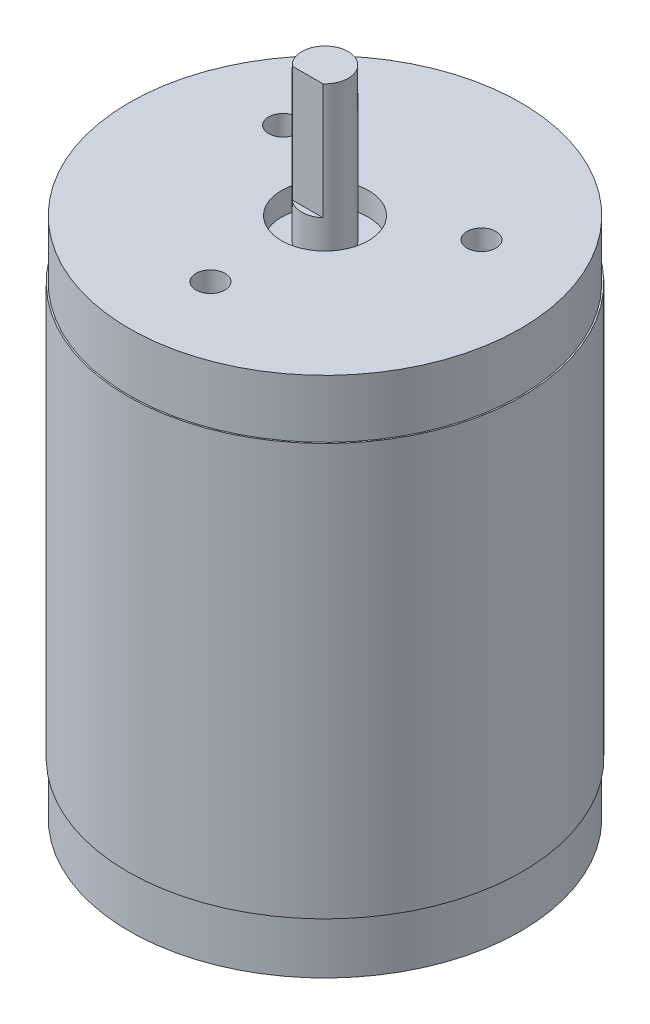
ISO-10303-21;
HEADER;
FILE_DESCRIPTION(('STEP AP214'),'2;1');
FILE_NAME('part.step','',(''),(''),'','','');
FILE_SCHEMA(('AUTOMOTIVE_DESIGN { 1 0 10303 214 1 1 1 1 }'));
ENDSEC;
DATA;
#1=APPLICATION_CONTEXT('core data for automotive mechanical design processes');
#2=APPLICATION_PROTOCOL_DEFINITION('international standard','automotive_design',2000,#1);
#3=PRODUCT_CONTEXT('',#1,'mechanical');
#4=PRODUCT('Part','Part','',(#3));
#5=PRODUCT_RELATED_PRODUCT_CATEGORY('part','',(#4));
#6=PRODUCT_DEFINITION_FORMATION('','',#4);
#7=PRODUCT_DEFINITION_CONTEXT('part definition',#1,'design');
#8=PRODUCT_DEFINITION('design','',#6,#7);
#9=PRODUCT_DEFINITION_SHAPE('','',#8);
#10=(LENGTH_UNIT() NAMED_UNIT(*) SI_UNIT(.MILLI.,.METRE.));
#11=(NAMED_UNIT(*) PLANE_ANGLE_UNIT() SI_UNIT($,.RADIAN.));
#12=(NAMED_UNIT(*) SI_UNIT($,.STERADIAN.) SOLID_ANGLE_UNIT());
#13=UNCERTAINTY_MEASURE_WITH_UNIT(LENGTH_MEASURE(1.E-05),#10,'distance_accuracy_value','');
#14=(GEOMETRIC_REPRESENTATION_CONTEXT(3) GLOBAL_UNCERTAINTY_ASSIGNED_CONTEXT((#13)) GLOBAL_UNIT_ASSIGNED_CONTEXT((#10,
#11,#12)) REPRESENTATION_CONTEXT('',''));
#15=CARTESIAN_POINT('',(0.,0.,0.));
#16=DIRECTION('',(0.,0.,1.));
#17=DIRECTION('',(1.,0.,0.));
#18=AXIS2_PLACEMENT_3D('',#15,#16,#17);
#19=CARTESIAN_POINT('',(33.75,0.,0.));
#20=DIRECTION('',(0.,1.,0.));
#21=DIRECTION('',(-1.,0.,0.));
#22=AXIS2_PLACEMENT_3D('',#19,#20,#21);
#23=PLANE('',#22);
#24=CARTESIAN_POINT('',(0.,0.,0.));
#25=DIRECTION('',(0.,-1.,0.));
#26=DIRECTION('',(1.,0.,0.));
#27=AXIS2_PLACEMENT_3D('',#24,#25,#26);
#28=CIRCLE('',#27,32.75);
#29=CARTESIAN_POINT('',(32.75,0.,0.));
#30=VERTEX_POINT('',#29);
#31=EDGE_CURVE('P0_E49',#30,#30,#28,.T.);
#32=ORIENTED_EDGE('',*,*,#31,.T.);
#33=EDGE_LOOP('',(#32));
#34=FACE_BOUND('',#33,.T.);
#35=CARTESIAN_POINT('',(0.,0.,0.));
#36=DIRECTION('',(0.,-1.,0.));
#37=DIRECTION('',(1.,0.,0.));
#38=AXIS2_PLACEMENT_3D('',#35,#36,#37);
#39=CIRCLE('',#38,33.75);
#40=CARTESIAN_POINT('',(33.75,0.,0.));
#41=VERTEX_POINT('',#40);
#42=EDGE_CURVE('P0_E10',#41,#41,#39,.T.);
#43=ORIENTED_EDGE('',*,*,#42,.F.);
#44=EDGE_LOOP('',(#43));
#45=FACE_BOUND('',#44,.T.);
#46=ADVANCED_FACE('P0_F15',(#34,#45),#23,.T.);
#47=CARTESIAN_POINT('',(0.,-19.,0.));
#48=DIRECTION('',(0.,-1.,0.));
#49=DIRECTION('',(1.,0.,0.));
#50=AXIS2_PLACEMENT_3D('',#47,#48,#49);
#51=CYLINDRICAL_SURFACE('',#50,33.75);
#52=ORIENTED_EDGE('',*,*,#42,.T.);
#53=EDGE_LOOP('',(#52));
#54=FACE_BOUND('',#53,.T.);
#55=CARTESIAN_POINT('',(0.,-9.,0.));
#56=DIRECTION('',(0.,-1.,0.));
#57=DIRECTION('',(1.,0.,0.));
#58=AXIS2_PLACEMENT_3D('',#55,#56,#57);
#59=CIRCLE('',#58,33.75);
#60=CARTESIAN_POINT('',(33.75,-9.,0.));
#61=VERTEX_POINT('',#60);
#62=EDGE_CURVE('P0_E21',#61,#61,#59,.T.);
#63=ORIENTED_EDGE('',*,*,#62,.F.);
#64=EDGE_LOOP('',(#63));
#65=FACE_BOUND('',#64,.T.);
#66=ADVANCED_FACE('P0_F68',(#54,#65),#51,.T.);
#67=CARTESIAN_POINT('',(33.75,-9.,0.));
#68=DIRECTION('',(0.,-1.,0.));
#69=DIRECTION('',(1.,0.,0.));
#70=AXIS2_PLACEMENT_3D('',#67,#68,#69);
#71=PLANE('',#70);
#72=ORIENTED_EDGE('',*,*,#62,.T.);
#73=EDGE_LOOP('',(#72));
#74=FACE_BOUND('',#73,.T.);
#75=CARTESIAN_POINT('',(0.,-9.,0.));
#76=DIRECTION('',(0.,-1.,0.));
#77=DIRECTION('',(1.,0.,0.));
#78=AXIS2_PLACEMENT_3D('',#75,#76,#77);
#79=CIRCLE('',#78,13.25);
#80=CARTESIAN_POINT('',(13.25,-9.,0.));
#81=VERTEX_POINT('',#80);
#82=EDGE_CURVE('P0_E25',#81,#81,#79,.T.);
#83=ORIENTED_EDGE('',*,*,#82,.F.);
#84=EDGE_LOOP('',(#83));
#85=FACE_BOUND('',#84,.T.);
#86=ADVANCED_FACE('P0_F72',(#74,#85),#71,.T.);
#87=CARTESIAN_POINT('',(0.,-19.,0.));
#88=DIRECTION('',(0.,-1.,0.));
#89=DIRECTION('',(1.,0.,0.));
#90=AXIS2_PLACEMENT_3D('',#87,#88,#89);
#91=CYLINDRICAL_SURFACE('',#90,13.25);
#92=ORIENTED_EDGE('',*,*,#82,.T.);
#93=EDGE_LOOP('',(#92));
#94=FACE_BOUND('',#93,.T.);
#95=CARTESIAN_POINT('',(0.,-19.,0.));
#96=DIRECTION('',(0.,-1.,0.));
#97=DIRECTION('',(1.,0.,0.));
#98=AXIS2_PLACEMENT_3D('',#95,#96,#97);
#99=CIRCLE('',#98,13.25);
#100=CARTESIAN_POINT('',(13.25,-19.,0.));
#101=VERTEX_POINT('',#100);
#102=EDGE_CURVE('P0_E29',#101,#101,#99,.T.);
#103=ORIENTED_EDGE('',*,*,#102,.F.);
#104=EDGE_LOOP('',(#103));
#105=FACE_BOUND('',#104,.T.);
#106=ADVANCED_FACE('P0_F76',(#94,#105),#91,.T.);
#107=CARTESIAN_POINT('',(13.25,-19.,0.));
#108=DIRECTION('',(0.,-1.,0.));
#109=DIRECTION('',(1.,0.,0.));
#110=AXIS2_PLACEMENT_3D('',#107,#108,#109);
#111=PLANE('',#110);
#112=ORIENTED_EDGE('',*,*,#102,.T.);
#113=EDGE_LOOP('',(#112));
#114=FACE_BOUND('',#113,.T.);
#115=ADVANCED_FACE('P0_F82',(#114),#111,.T.);
#116=CARTESIAN_POINT('',(11.25,-17.,0.));
#117=DIRECTION('',(0.,1.,0.));
#118=DIRECTION('',(-1.,0.,0.));
#119=AXIS2_PLACEMENT_3D('',#116,#117,#118);
#120=PLANE('',#119);
#121=CARTESIAN_POINT('',(0.,-17.,0.));
#122=DIRECTION('',(0.,-1.,0.));
#123=DIRECTION('',(1.,0.,0.));
#124=AXIS2_PLACEMENT_3D('',#121,#122,#123);
#125=CIRCLE('',#124,11.25);
#126=CARTESIAN_POINT('',(11.25,-17.,0.));
#127=VERTEX_POINT('',#126);
#128=EDGE_CURVE('P0_E34',#127,#127,#125,.T.);
#129=ORIENTED_EDGE('',*,*,#128,.F.);
#130=EDGE_LOOP('',(#129));
#131=FACE_BOUND('',#130,.T.);
#132=ADVANCED_FACE('P0_F86',(#131),#120,.T.);
#133=CARTESIAN_POINT('',(0.,-19.,0.));
#134=DIRECTION('',(0.,-1.,0.));
#135=DIRECTION('',(1.,0.,0.));
#136=AXIS2_PLACEMENT_3D('',#133,#134,#135);
#137=CYLINDRICAL_SURFACE('',#136,11.25);
#138=ORIENTED_EDGE('',*,*,#128,.T.);
#139=EDGE_LOOP('',(#138));
#140=FACE_BOUND('',#139,.T.);
#141=CARTESIAN_POINT('',(0.,-7.,0.));
#142=DIRECTION('',(0.,-1.,0.));
#143=DIRECTION('',(1.,0.,0.));
#144=AXIS2_PLACEMENT_3D('',#141,#142,#143);
#145=CIRCLE('',#144,11.25);
#146=CARTESIAN_POINT('',(11.25,-7.,0.));
#147=VERTEX_POINT('',#146);
#148=EDGE_CURVE('P0_E37',#147,#147,#145,.T.);
#149=ORIENTED_EDGE('',*,*,#148,.F.);
#150=EDGE_LOOP('',(#149));
#151=FACE_BOUND('',#150,.T.);
#152=ADVANCED_FACE('P0_F90',(#140,#151),#137,.F.);
#153=CARTESIAN_POINT('',(31.75,-7.,0.));
#154=DIRECTION('',(0.,1.,0.));
#155=DIRECTION('',(-1.,0.,0.));
#156=AXIS2_PLACEMENT_3D('',#153,#154,#155);
#157=PLANE('',#156);
#158=ORIENTED_EDGE('',*,*,#148,.T.);
#159=EDGE_LOOP('',(#158));
#160=FACE_BOUND('',#159,.T.);
#161=CARTESIAN_POINT('',(0.,-7.,0.));
#162=DIRECTION('',(0.,-1.,0.));
#163=DIRECTION('',(1.,0.,0.));
#164=AXIS2_PLACEMENT_3D('',#161,#162,#163);
#165=CIRCLE('',#164,31.75);
#166=CARTESIAN_POINT('',(31.75,-7.,0.));
#167=VERTEX_POINT('',#166);
#168=EDGE_CURVE('P0_E40',#167,#167,#165,.T.);
#169=ORIENTED_EDGE('',*,*,#168,.F.);
#170=EDGE_LOOP('',(#169));
#171=FACE_BOUND('',#170,.T.);
#172=ADVANCED_FACE('P0_F94',(#160,#171),#157,.T.);
#173=CARTESIAN_POINT('',(0.,-19.,0.));
#174=DIRECTION('',(0.,-1.,0.));
#175=DIRECTION('',(1.,0.,0.));
#176=AXIS2_PLACEMENT_3D('',#173,#174,#175);
#177=CYLINDRICAL_SURFACE('',#176,31.75);
#178=ORIENTED_EDGE('',*,*,#168,.T.);
#179=EDGE_LOOP('',(#178));
#180=FACE_BOUND('',#179,.T.);
#181=CARTESIAN_POINT('',(0.,3.,0.));
#182=DIRECTION('',(0.,-1.,0.));
#183=DIRECTION('',(1.,0.,0.));
#184=AXIS2_PLACEMENT_3D('',#181,#182,#183);
#185=CIRCLE('',#184,31.75);
#186=CARTESIAN_POINT('',(31.75,3.,0.));
#187=VERTEX_POINT('',#186);
#188=EDGE_CURVE('P0_E43',#187,#187,#185,.T.);
#189=ORIENTED_EDGE('',*,*,#188,.F.);
#190=EDGE_LOOP('',(#189));
#191=FACE_BOUND('',#190,.T.);
#192=ADVANCED_FACE('P0_F64',(#180,#191),#177,.F.);
#193=CARTESIAN_POINT('',(32.75,3.,0.));
#194=DIRECTION('',(0.,1.,0.));
#195=DIRECTION('',(-1.,0.,0.));
#196=AXIS2_PLACEMENT_3D('',#193,#194,#195);
#197=PLANE('',#196);
#198=ORIENTED_EDGE('',*,*,#188,.T.);
#199=EDGE_LOOP('',(#198));
#200=FACE_BOUND('',#199,.T.);
#201=CARTESIAN_POINT('',(0.,3.,0.));
#202=DIRECTION('',(0.,-1.,0.));
#203=DIRECTION('',(1.,0.,0.));
#204=AXIS2_PLACEMENT_3D('',#201,#202,#203);
#205=CIRCLE('',#204,32.75);
#206=CARTESIAN_POINT('',(32.75,3.,0.));
#207=VERTEX_POINT('',#206);
#208=EDGE_CURVE('P0_E46',#207,#207,#205,.T.);
#209=ORIENTED_EDGE('',*,*,#208,.F.);
#210=EDGE_LOOP('',(#209));
#211=FACE_BOUND('',#210,.T.);
#212=ADVANCED_FACE('P0_F57',(#200,#211),#197,.T.);
#213=CARTESIAN_POINT('',(0.,-19.,0.));
#214=DIRECTION('',(0.,-1.,0.));
#215=DIRECTION('',(1.,0.,0.));
#216=AXIS2_PLACEMENT_3D('',#213,#214,#215);
#217=CYLINDRICAL_SURFACE('',#216,32.75);
#218=ORIENTED_EDGE('',*,*,#208,.T.);
#219=EDGE_LOOP('',(#218));
#220=FACE_BOUND('',#219,.T.);
#221=ORIENTED_EDGE('',*,*,#31,.F.);
#222=EDGE_LOOP('',(#221));
#223=FACE_BOUND('',#222,.T.);
#224=ADVANCED_FACE('P0_F55',(#220,#223),#217,.T.);
#225=CLOSED_SHELL('',(#46,#66,#86,#106,#115,#132,#152,#172,#192,#212,#224));
#226=MANIFOLD_SOLID_BREP('P0_B1',#225);
#227=CARTESIAN_POINT('',(0.,71.,0.));
#228=DIRECTION('',(0.,1.,0.));
#229=DIRECTION('',(0.,0.,1.));
#230=AXIS2_PLACEMENT_3D('',#227,#228,#229);
#231=PLANE('',#230);
#232=CARTESIAN_POINT('',(0.,71.,0.));
#233=DIRECTION('',(0.,1.,0.));
#234=DIRECTION('',(0.,0.,1.));
#235=AXIS2_PLACEMENT_3D('',#232,#233,#234);
#236=CIRCLE('',#235,34.);
#237=CARTESIAN_POINT('',(0.,71.,34.));
#238=VERTEX_POINT('',#237);
#239=EDGE_CURVE('P1_E10',#238,#238,#236,.T.);
#240=ORIENTED_EDGE('',*,*,#239,.T.);
#241=EDGE_LOOP('',(#240));
#242=FACE_BOUND('',#241,.T.);
#243=CARTESIAN_POINT('',(0.,71.,0.));
#244=DIRECTION('',(0.,1.,0.));
#245=DIRECTION('',(0.,0.,1.));
#246=AXIS2_PLACEMENT_3D('',#243,#244,#245);
#247=CIRCLE('',#246,33.);
#248=CARTESIAN_POINT('',(0.,71.,33.));
#249=VERTEX_POINT('',#248);
#250=EDGE_CURVE('P1_E26',#249,#249,#247,.T.);
#251=ORIENTED_EDGE('',*,*,#250,.F.);
#252=EDGE_LOOP('',(#251));
#253=FACE_BOUND('',#252,.T.);
#254=ADVANCED_FACE('P1_F15',(#242,#253),#231,.T.);
#255=CARTESIAN_POINT('',(0.,0.,0.));
#256=DIRECTION('',(0.,1.,0.));
#257=DIRECTION('',(0.,0.,1.));
#258=AXIS2_PLACEMENT_3D('',#255,#256,#257);
#259=PLANE('',#258);
#260=CARTESIAN_POINT('',(0.,0.,0.));
#261=DIRECTION('',(0.,1.,0.));
#262=DIRECTION('',(0.,0.,1.));
#263=AXIS2_PLACEMENT_3D('',#260,#261,#262);
#264=CIRCLE('',#263,34.);
#265=CARTESIAN_POINT('',(0.,0.,34.));
#266=VERTEX_POINT('',#265);
#267=EDGE_CURVE('P1_E19',#266,#266,#264,.T.);
#268=ORIENTED_EDGE('',*,*,#267,.F.);
#269=EDGE_LOOP('',(#268));
#270=FACE_BOUND('',#269,.T.);
#271=CARTESIAN_POINT('',(0.,0.,0.));
#272=DIRECTION('',(0.,1.,0.));
#273=DIRECTION('',(0.,0.,1.));
#274=AXIS2_PLACEMENT_3D('',#271,#272,#273);
#275=CIRCLE('',#274,33.);
#276=CARTESIAN_POINT('',(0.,0.,33.));
#277=VERTEX_POINT('',#276);
#278=EDGE_CURVE('P1_E28',#277,#277,#275,.T.);
#279=ORIENTED_EDGE('',*,*,#278,.T.);
#280=EDGE_LOOP('',(#279));
#281=FACE_BOUND('',#280,.T.);
#282=ADVANCED_FACE('P1_F38',(#270,#281),#259,.F.);
#283=CARTESIAN_POINT('',(0.,71.,0.));
#284=DIRECTION('',(0.,-1.,0.));
#285=DIRECTION('',(0.,0.,-1.));
#286=AXIS2_PLACEMENT_3D('',#283,#284,#285);
#287=CYLINDRICAL_SURFACE('',#286,34.);
#288=ORIENTED_EDGE('',*,*,#239,.F.);
#289=EDGE_LOOP('',(#288));
#290=FACE_BOUND('',#289,.T.);
#291=ORIENTED_EDGE('',*,*,#267,.T.);
#292=EDGE_LOOP('',(#291));
#293=FACE_BOUND('',#292,.T.);
#294=ADVANCED_FACE('P1_F17',(#290,#293),#287,.T.);
#295=CARTESIAN_POINT('',(0.,71.,0.));
#296=DIRECTION('',(0.,-1.,0.));
#297=DIRECTION('',(0.,0.,-1.));
#298=AXIS2_PLACEMENT_3D('',#295,#296,#297);
#299=CYLINDRICAL_SURFACE('',#298,33.);
#300=ORIENTED_EDGE('',*,*,#250,.T.);
#301=EDGE_LOOP('',(#300));
#302=FACE_BOUND('',#301,.T.);
#303=ORIENTED_EDGE('',*,*,#278,.F.);
#304=EDGE_LOOP('',(#303));
#305=FACE_BOUND('',#304,.T.);
#306=ADVANCED_FACE('P1_F34',(#302,#305),#299,.F.);
#307=CLOSED_SHELL('',(#254,#282,#294,#306));
#308=MANIFOLD_SOLID_BREP('P1_B1',#307);
#309=CARTESIAN_POINT('',(0.,103.5,0.));
#310=DIRECTION('',(0.,1.,0.));
#311=DIRECTION('',(0.,0.,1.));
#312=AXIS2_PLACEMENT_3D('',#309,#310,#311);
#313=PLANE('',#312);
#314=DIRECTION('',(-1.,0.,0.));
#315=VECTOR('',#314,1.);
#316=CARTESIAN_POINT('',(-2.64575131106459,103.5,3.));
#317=LINE('',#316,#315);
#318=CARTESIAN_POINT('',(2.64575131106459,103.5,3.));
#319=VERTEX_POINT('',#318);
#320=CARTESIAN_POINT('',(-2.64575131106459,103.5,3.));
#321=VERTEX_POINT('',#320);
#322=EDGE_CURVE('P2_E44',#319,#321,#317,.T.);
#323=ORIENTED_EDGE('',*,*,#322,.F.);
#324=CARTESIAN_POINT('',(0.,103.5,0.));
#325=DIRECTION('',(0.,-1.,0.));
#326=DIRECTION('',(0.,0.,-1.));
#327=AXIS2_PLACEMENT_3D('',#324,#325,#326);
#328=CIRCLE('',#327,4.);
#329=EDGE_CURVE('P2_E10',#321,#319,#328,.T.);
#330=ORIENTED_EDGE('',*,*,#329,.F.);
#331=EDGE_LOOP('',(#323,#330));
#332=FACE_BOUND('',#331,.T.);
#333=ADVANCED_FACE('P2_F16',(#332),#313,.T.);
#334=CARTESIAN_POINT('',(0.,75.,0.));
#335=DIRECTION('',(0.,-1.,0.));
#336=DIRECTION('',(0.,0.,-1.));
#337=AXIS2_PLACEMENT_3D('',#334,#335,#336);
#338=CYLINDRICAL_SURFACE('',#337,4.);
#339=DIRECTION('',(0.,1.,0.));
#340=VECTOR('',#339,1.);
#341=CARTESIAN_POINT('',(2.64575131106459,83.5,3.));
#342=LINE('',#341,#340);
#343=CARTESIAN_POINT('',(2.64575131106459,83.5,3.));
#344=VERTEX_POINT('',#343);
#345=EDGE_CURVE('P2_E41',#344,#319,#342,.T.);
#346=ORIENTED_EDGE('',*,*,#345,.F.);
#347=CARTESIAN_POINT('',(0.,83.5,0.));
#348=DIRECTION('',(0.,1.,0.));
#349=DIRECTION('',(0.,0.,1.));
#350=AXIS2_PLACEMENT_3D('',#347,#348,#349);
#351=CIRCLE('',#350,4.);
#352=CARTESIAN_POINT('',(-2.64575131106459,83.5,3.));
#353=VERTEX_POINT('',#352);
#354=EDGE_CURVE('P2_E34',#353,#344,#351,.T.);
#355=ORIENTED_EDGE('',*,*,#354,.F.);
#356=DIRECTION('',(0.,1.,0.));
#357=VECTOR('',#356,1.);
#358=CARTESIAN_POINT('',(-2.64575131106459,83.5,3.));
#359=LINE('',#358,#357);
#360=EDGE_CURVE('P2_E47',#353,#321,#359,.T.);
#361=ORIENTED_EDGE('',*,*,#360,.T.);
#362=ORIENTED_EDGE('',*,*,#329,.T.);
#363=EDGE_LOOP('',(#346,#355,#361,#362));
#364=FACE_BOUND('',#363,.T.);
#365=CARTESIAN_POINT('',(0.,77.,0.));
#366=DIRECTION('',(0.,-1.,0.));
#367=DIRECTION('',(0.,0.,-1.));
#368=AXIS2_PLACEMENT_3D('',#365,#366,#367);
#369=CIRCLE('',#368,4.);
#370=CARTESIAN_POINT('',(0.,77.,-4.));
#371=VERTEX_POINT('',#370);
#372=EDGE_CURVE('P2_E23',#371,#371,#369,.T.);
#373=ORIENTED_EDGE('',*,*,#372,.F.);
#374=EDGE_LOOP('',(#373));
#375=FACE_BOUND('',#374,.T.);
#376=ADVANCED_FACE('P2_F52',(#364,#375),#338,.T.);
#377=CARTESIAN_POINT('',(4.,77.,0.));
#378=DIRECTION('',(0.,1.,0.));
#379=DIRECTION('',(0.,0.,1.));
#380=AXIS2_PLACEMENT_3D('',#377,#378,#379);
#381=PLANE('',#380);
#382=ORIENTED_EDGE('',*,*,#372,.T.);
#383=EDGE_LOOP('',(#382));
#384=FACE_BOUND('',#383,.T.);
#385=CARTESIAN_POINT('',(0.,77.,0.));
#386=DIRECTION('',(0.,-1.,0.));
#387=DIRECTION('',(0.,0.,-1.));
#388=AXIS2_PLACEMENT_3D('',#385,#386,#387);
#389=CIRCLE('',#388,10.);
#390=CARTESIAN_POINT('',(0.,77.,-10.));
#391=VERTEX_POINT('',#390);
#392=EDGE_CURVE('P2_E57',#391,#391,#389,.T.);
#393=ORIENTED_EDGE('',*,*,#392,.F.);
#394=EDGE_LOOP('',(#393));
#395=FACE_BOUND('',#394,.T.);
#396=ADVANCED_FACE('P2_F65',(#384,#395),#381,.T.);
#397=CARTESIAN_POINT('',(0.,75.,0.));
#398=DIRECTION('',(0.,-1.,0.));
#399=DIRECTION('',(0.,0.,-1.));
#400=AXIS2_PLACEMENT_3D('',#397,#398,#399);
#401=CYLINDRICAL_SURFACE('',#400,10.);
#402=ORIENTED_EDGE('',*,*,#392,.T.);
#403=EDGE_LOOP('',(#402));
#404=FACE_BOUND('',#403,.T.);
#405=CARTESIAN_POINT('',(0.,75.,0.));
#406=DIRECTION('',(0.,-1.,0.));
#407=DIRECTION('',(0.,0.,-1.));
#408=AXIS2_PLACEMENT_3D('',#405,#406,#407);
#409=CIRCLE('',#408,10.);
#410=CARTESIAN_POINT('',(0.,75.,-10.));
#411=VERTEX_POINT('',#410);
#412=EDGE_CURVE('P2_E54',#411,#411,#409,.T.);
#413=ORIENTED_EDGE('',*,*,#412,.F.);
#414=EDGE_LOOP('',(#413));
#415=FACE_BOUND('',#414,.T.);
#416=ADVANCED_FACE('P2_F73',(#404,#415),#401,.T.);
#417=CARTESIAN_POINT('',(10.,75.,0.));
#418=DIRECTION('',(0.,-1.,0.));
#419=DIRECTION('',(0.,0.,-1.));
#420=AXIS2_PLACEMENT_3D('',#417,#418,#419);
#421=PLANE('',#420);
#422=ORIENTED_EDGE('',*,*,#412,.T.);
#423=EDGE_LOOP('',(#422));
#424=FACE_BOUND('',#423,.T.);
#425=ADVANCED_FACE('P2_F78',(#424),#421,.T.);
#426=CARTESIAN_POINT('',(-2.64575131106459,83.5,3.));
#427=DIRECTION('',(0.,0.,-1.));
#428=DIRECTION('',(-1.,0.,0.));
#429=AXIS2_PLACEMENT_3D('',#426,#427,#428);
#430=PLANE('',#429);
#431=ORIENTED_EDGE('',*,*,#322,.T.);
#432=ORIENTED_EDGE('',*,*,#360,.F.);
#433=DIRECTION('',(-1.,0.,0.));
#434=VECTOR('',#433,1.);
#435=CARTESIAN_POINT('',(-2.64575131106459,83.5,3.));
#436=LINE('',#435,#434);
#437=EDGE_CURVE('P2_E29',#344,#353,#436,.T.);
#438=ORIENTED_EDGE('',*,*,#437,.F.);
#439=ORIENTED_EDGE('',*,*,#345,.T.);
#440=EDGE_LOOP('',(#431,#432,#438,#439));
#441=FACE_BOUND('',#440,.T.);
#442=ADVANCED_FACE('P2_F43',(#441),#430,.F.);
#443=CARTESIAN_POINT('',(0.,83.5,0.));
#444=DIRECTION('',(0.,1.,0.));
#445=DIRECTION('',(0.,0.,1.));
#446=AXIS2_PLACEMENT_3D('',#443,#444,#445);
#447=PLANE('',#446);
#448=ORIENTED_EDGE('',*,*,#354,.T.);
#449=ORIENTED_EDGE('',*,*,#437,.T.);
#450=EDGE_LOOP('',(#448,#449));
#451=FACE_BOUND('',#450,.T.);
#452=ADVANCED_FACE('P2_F85',(#451),#447,.T.);
#453=CLOSED_SHELL('',(#333,#376,#396,#416,#425,#442,#452));
#454=MANIFOLD_SOLID_BREP('P2_B1',#453);
#455=CARTESIAN_POINT('',(0.,81.,0.));
#456=DIRECTION('',(0.,1.,0.));
#457=DIRECTION('',(-1.,0.,0.));
#458=AXIS2_PLACEMENT_3D('',#455,#456,#457);
#459=CYLINDRICAL_SURFACE('',#458,31.75);
#460=CARTESIAN_POINT('',(0.,68.,0.));
#461=DIRECTION('',(0.,1.,0.));
#462=DIRECTION('',(-1.,0.,0.));
#463=AXIS2_PLACEMENT_3D('',#460,#461,#462);
#464=CIRCLE('',#463,31.75);
#465=CARTESIAN_POINT('',(-31.75,68.,0.));
#466=VERTEX_POINT('',#465);
#467=EDGE_CURVE('P3_E10',#466,#466,#464,.T.);
#468=ORIENTED_EDGE('',*,*,#467,.F.);
#469=EDGE_LOOP('',(#468));
#470=FACE_BOUND('',#469,.T.);
#471=CARTESIAN_POINT('',(0.,77.,0.));
#472=DIRECTION('',(0.,1.,0.));
#473=DIRECTION('',(-1.,0.,0.));
#474=AXIS2_PLACEMENT_3D('',#471,#472,#473);
#475=CIRCLE('',#474,31.75);
#476=CARTESIAN_POINT('',(-31.75,77.,0.));
#477=VERTEX_POINT('',#476);
#478=EDGE_CURVE('P3_E42',#477,#477,#475,.T.);
#479=ORIENTED_EDGE('',*,*,#478,.T.);
#480=EDGE_LOOP('',(#479));
#481=FACE_BOUND('',#480,.T.);
#482=ADVANCED_FACE('P3_F15',(#470,#481),#459,.F.);
#483=CARTESIAN_POINT('',(31.75,68.,0.));
#484=DIRECTION('',(0.,1.,0.));
#485=DIRECTION('',(-1.,0.,0.));
#486=AXIS2_PLACEMENT_3D('',#483,#484,#485);
#487=PLANE('',#486);
#488=CARTESIAN_POINT('',(0.,68.,0.));
#489=DIRECTION('',(0.,1.,0.));
#490=DIRECTION('',(-1.,0.,0.));
#491=AXIS2_PLACEMENT_3D('',#488,#489,#490);
#492=CIRCLE('',#491,32.75);
#493=CARTESIAN_POINT('',(-32.75,68.,0.));
#494=VERTEX_POINT('',#493);
#495=EDGE_CURVE('P3_E22',#494,#494,#492,.T.);
#496=ORIENTED_EDGE('',*,*,#495,.F.);
#497=EDGE_LOOP('',(#496));
#498=FACE_BOUND('',#497,.T.);
#499=ORIENTED_EDGE('',*,*,#467,.T.);
#500=EDGE_LOOP('',(#499));
#501=FACE_BOUND('',#500,.T.);
#502=ADVANCED_FACE('P3_F66',(#498,#501),#487,.F.);
#503=CARTESIAN_POINT('',(0.,81.,0.));
#504=DIRECTION('',(0.,1.,0.));
#505=DIRECTION('',(-1.,0.,0.));
#506=AXIS2_PLACEMENT_3D('',#503,#504,#505);
#507=CYLINDRICAL_SURFACE('',#506,32.75);
#508=CARTESIAN_POINT('',(0.,71.,0.));
#509=DIRECTION('',(0.,1.,0.));
#510=DIRECTION('',(-1.,0.,0.));
#511=AXIS2_PLACEMENT_3D('',#508,#509,#510);
#512=CIRCLE('',#511,32.75);
#513=CARTESIAN_POINT('',(-32.75,71.,0.));
#514=VERTEX_POINT('',#513);
#515=EDGE_CURVE('P3_E27',#514,#514,#512,.T.);
#516=ORIENTED_EDGE('',*,*,#515,.F.);
#517=EDGE_LOOP('',(#516));
#518=FACE_BOUND('',#517,.T.);
#519=ORIENTED_EDGE('',*,*,#495,.T.);
#520=EDGE_LOOP('',(#519));
#521=FACE_BOUND('',#520,.T.);
#522=ADVANCED_FACE('P3_F63',(#518,#521),#507,.T.);
#523=CARTESIAN_POINT('',(32.75,71.,0.));
#524=DIRECTION('',(0.,1.,0.));
#525=DIRECTION('',(-1.,0.,0.));
#526=AXIS2_PLACEMENT_3D('',#523,#524,#525);
#527=PLANE('',#526);
#528=CARTESIAN_POINT('',(0.,71.,0.));
#529=DIRECTION('',(0.,1.,0.));
#530=DIRECTION('',(-1.,0.,0.));
#531=AXIS2_PLACEMENT_3D('',#528,#529,#530);
#532=CIRCLE('',#531,33.75);
#533=CARTESIAN_POINT('',(-33.75,71.,0.));
#534=VERTEX_POINT('',#533);
#535=EDGE_CURVE('P3_E51',#534,#534,#532,.T.);
#536=ORIENTED_EDGE('',*,*,#535,.F.);
#537=EDGE_LOOP('',(#536));
#538=FACE_BOUND('',#537,.T.);
#539=ORIENTED_EDGE('',*,*,#515,.T.);
#540=EDGE_LOOP('',(#539));
#541=FACE_BOUND('',#540,.T.);
#542=ADVANCED_FACE('P3_F61',(#538,#541),#527,.F.);
#543=CARTESIAN_POINT('',(0.,81.,0.));
#544=DIRECTION('',(0.,1.,0.));
#545=DIRECTION('',(-1.,0.,0.));
#546=AXIS2_PLACEMENT_3D('',#543,#544,#545);
#547=CYLINDRICAL_SURFACE('',#546,33.75);
#548=CARTESIAN_POINT('',(0.,81.,0.));
#549=DIRECTION('',(0.,1.,0.));
#550=DIRECTION('',(-1.,0.,0.));
#551=AXIS2_PLACEMENT_3D('',#548,#549,#550);
#552=CIRCLE('',#551,33.75);
#553=CARTESIAN_POINT('',(-33.75,81.,0.));
#554=VERTEX_POINT('',#553);
#555=EDGE_CURVE('P3_E46',#554,#554,#552,.T.);
#556=ORIENTED_EDGE('',*,*,#555,.F.);
#557=EDGE_LOOP('',(#556));
#558=FACE_BOUND('',#557,.T.);
#559=ORIENTED_EDGE('',*,*,#535,.T.);
#560=EDGE_LOOP('',(#559));
#561=FACE_BOUND('',#560,.T.);
#562=ADVANCED_FACE('P3_F79',(#558,#561),#547,.T.);
#563=CARTESIAN_POINT('',(33.75,81.,0.));
#564=DIRECTION('',(0.,-1.,0.));
#565=DIRECTION('',(1.,0.,0.));
#566=AXIS2_PLACEMENT_3D('',#563,#564,#565);
#567=PLANE('',#566);
#568=CARTESIAN_POINT('',(0.,81.,19.75));
#569=DIRECTION('',(0.,1.,0.));
#570=DIRECTION('',(-1.,0.,0.));
#571=AXIS2_PLACEMENT_3D('',#568,#569,#570);
#572=CIRCLE('',#571,2.5);
#573=CARTESIAN_POINT('',(-2.5,81.,19.75));
#574=VERTEX_POINT('',#573);
#575=EDGE_CURVE('P3_E35',#574,#574,#572,.T.);
#576=ORIENTED_EDGE('',*,*,#575,.F.);
#577=EDGE_LOOP('',(#576));
#578=FACE_BOUND('',#577,.T.);
#579=CARTESIAN_POINT('',(0.,81.,0.));
#580=DIRECTION('',(0.,1.,0.));
#581=DIRECTION('',(-1.,0.,0.));
#582=AXIS2_PLACEMENT_3D('',#579,#580,#581);
#583=CIRCLE('',#582,7.5);
#584=CARTESIAN_POINT('',(-7.5,81.,0.));
#585=VERTEX_POINT('',#584);
#586=EDGE_CURVE('P3_E115',#585,#585,#583,.T.);
#587=ORIENTED_EDGE('',*,*,#586,.F.);
#588=EDGE_LOOP('',(#587));
#589=FACE_BOUND('',#588,.T.);
#590=CARTESIAN_POINT('',(17.1040017247427,81.,-9.87500000000001));
#591=DIRECTION('',(0.,1.,0.));
#592=DIRECTION('',(-1.,0.,0.));
#593=AXIS2_PLACEMENT_3D('',#590,#591,#592);
#594=CIRCLE('',#593,2.5);
#595=CARTESIAN_POINT('',(14.6040017247427,81.,-9.87500000000001));
#596=VERTEX_POINT('',#595);
#597=EDGE_CURVE('P3_E54',#596,#596,#594,.T.);
#598=ORIENTED_EDGE('',*,*,#597,.F.);
#599=EDGE_LOOP('',(#598));
#600=FACE_BOUND('',#599,.T.);
#601=CARTESIAN_POINT('',(-17.1040017247427,81.,-9.875));
#602=DIRECTION('',(0.,1.,0.));
#603=DIRECTION('',(-1.,0.,0.));
#604=AXIS2_PLACEMENT_3D('',#601,#602,#603);
#605=CIRCLE('',#604,2.5);
#606=CARTESIAN_POINT('',(-19.6040017247427,81.,-9.875));
#607=VERTEX_POINT('',#606);
#608=EDGE_CURVE('P3_E111',#607,#607,#605,.T.);
#609=ORIENTED_EDGE('',*,*,#608,.F.);
#610=EDGE_LOOP('',(#609));
#611=FACE_BOUND('',#610,.T.);
#612=ORIENTED_EDGE('',*,*,#555,.T.);
#613=EDGE_LOOP('',(#612));
#614=FACE_BOUND('',#613,.T.);
#615=ADVANCED_FACE('P3_F83',(#578,#589,#600,#611,#614),#567,.F.);
#616=CARTESIAN_POINT('',(0.,77.,0.));
#617=DIRECTION('',(0.,1.,0.));
#618=DIRECTION('',(-1.,0.,0.));
#619=AXIS2_PLACEMENT_3D('',#616,#617,#618);
#620=PLANE('',#619);
#621=CARTESIAN_POINT('',(0.,77.,19.75));
#622=DIRECTION('',(0.,1.,0.));
#623=DIRECTION('',(-1.,0.,0.));
#624=AXIS2_PLACEMENT_3D('',#621,#622,#623);
#625=CIRCLE('',#624,2.5);
#626=CARTESIAN_POINT('',(-2.5,77.,19.75));
#627=VERTEX_POINT('',#626);
#628=EDGE_CURVE('P3_E18',#627,#627,#625,.T.);
#629=ORIENTED_EDGE('',*,*,#628,.T.);
#630=EDGE_LOOP('',(#629));
#631=FACE_BOUND('',#630,.T.);
#632=CARTESIAN_POINT('',(0.,77.,0.));
#633=DIRECTION('',(0.,1.,0.));
#634=DIRECTION('',(-1.,0.,0.));
#635=AXIS2_PLACEMENT_3D('',#632,#633,#634);
#636=CIRCLE('',#635,7.5);
#637=CARTESIAN_POINT('',(-7.5,77.,0.));
#638=VERTEX_POINT('',#637);
#639=EDGE_CURVE('P3_E37',#638,#638,#636,.T.);
#640=ORIENTED_EDGE('',*,*,#639,.T.);
#641=EDGE_LOOP('',(#640));
#642=FACE_BOUND('',#641,.T.);
#643=CARTESIAN_POINT('',(17.1040017247427,77.,-9.87500000000001));
#644=DIRECTION('',(0.,1.,0.));
#645=DIRECTION('',(-1.,0.,0.));
#646=AXIS2_PLACEMENT_3D('',#643,#644,#645);
#647=CIRCLE('',#646,2.5);
#648=CARTESIAN_POINT('',(14.6040017247427,77.,-9.87500000000001));
#649=VERTEX_POINT('',#648);
#650=EDGE_CURVE('P3_E34',#649,#649,#647,.T.);
#651=ORIENTED_EDGE('',*,*,#650,.T.);
#652=EDGE_LOOP('',(#651));
#653=FACE_BOUND('',#652,.T.);
#654=CARTESIAN_POINT('',(-17.1040017247427,77.,-9.875));
#655=DIRECTION('',(0.,1.,0.));
#656=DIRECTION('',(-1.,0.,0.));
#657=AXIS2_PLACEMENT_3D('',#654,#655,#656);
#658=CIRCLE('',#657,2.5);
#659=CARTESIAN_POINT('',(-19.6040017247427,77.,-9.875));
#660=VERTEX_POINT('',#659);
#661=EDGE_CURVE('P3_E31',#660,#660,#658,.T.);
#662=ORIENTED_EDGE('',*,*,#661,.T.);
#663=EDGE_LOOP('',(#662));
#664=FACE_BOUND('',#663,.T.);
#665=ORIENTED_EDGE('',*,*,#478,.F.);
#666=EDGE_LOOP('',(#665));
#667=FACE_BOUND('',#666,.T.);
#668=ADVANCED_FACE('P3_F87',(#631,#642,#653,#664,#667),#620,.F.);
#669=CARTESIAN_POINT('',(-17.1040017247427,68.,-9.875));
#670=DIRECTION('',(0.,1.,0.));
#671=DIRECTION('',(-1.,0.,0.));
#672=AXIS2_PLACEMENT_3D('',#669,#670,#671);
#673=CYLINDRICAL_SURFACE('',#672,2.5);
#674=ORIENTED_EDGE('',*,*,#608,.T.);
#675=EDGE_LOOP('',(#674));
#676=FACE_BOUND('',#675,.T.);
#677=ORIENTED_EDGE('',*,*,#661,.F.);
#678=EDGE_LOOP('',(#677));
#679=FACE_BOUND('',#678,.T.);
#680=ADVANCED_FACE('P3_F91',(#676,#679),#673,.F.);
#681=CARTESIAN_POINT('',(17.1040017247427,68.,-9.87500000000001));
#682=DIRECTION('',(0.,1.,0.));
#683=DIRECTION('',(-1.,0.,0.));
#684=AXIS2_PLACEMENT_3D('',#681,#682,#683);
#685=CYLINDRICAL_SURFACE('',#684,2.5);
#686=ORIENTED_EDGE('',*,*,#597,.T.);
#687=EDGE_LOOP('',(#686));
#688=FACE_BOUND('',#687,.T.);
#689=ORIENTED_EDGE('',*,*,#650,.F.);
#690=EDGE_LOOP('',(#689));
#691=FACE_BOUND('',#690,.T.);
#692=ADVANCED_FACE('P3_F92',(#688,#691),#685,.F.);
#693=CARTESIAN_POINT('',(0.,68.,0.));
#694=DIRECTION('',(0.,1.,0.));
#695=DIRECTION('',(-1.,0.,0.));
#696=AXIS2_PLACEMENT_3D('',#693,#694,#695);
#697=CYLINDRICAL_SURFACE('',#696,7.5);
#698=ORIENTED_EDGE('',*,*,#586,.T.);
#699=EDGE_LOOP('',(#698));
#700=FACE_BOUND('',#699,.T.);
#701=ORIENTED_EDGE('',*,*,#639,.F.);
#702=EDGE_LOOP('',(#701));
#703=FACE_BOUND('',#702,.T.);
#704=ADVANCED_FACE('P3_F95',(#700,#703),#697,.F.);
#705=CARTESIAN_POINT('',(0.,68.,19.75));
#706=DIRECTION('',(0.,1.,0.));
#707=DIRECTION('',(-1.,0.,0.));
#708=AXIS2_PLACEMENT_3D('',#705,#706,#707);
#709=CYLINDRICAL_SURFACE('',#708,2.5);
#710=ORIENTED_EDGE('',*,*,#575,.T.);
#711=EDGE_LOOP('',(#710));
#712=FACE_BOUND('',#711,.T.);
#713=ORIENTED_EDGE('',*,*,#628,.F.);
#714=EDGE_LOOP('',(#713));
#715=FACE_BOUND('',#714,.T.);
#716=ADVANCED_FACE('P3_F102',(#712,#715),#709,.F.);
#717=CLOSED_SHELL('',(#482,#502,#522,#542,#562,#615,#668,#680,#692,#704,#716));
#718=MANIFOLD_SOLID_BREP('P3_B1',#717);
#719=ADVANCED_BREP_SHAPE_REPRESENTATION('',(#18,#226,#308,#454,#718),#14);
#720=SHAPE_DEFINITION_REPRESENTATION(#9,#719);
ENDSEC;
END-ISO-10303-21;
